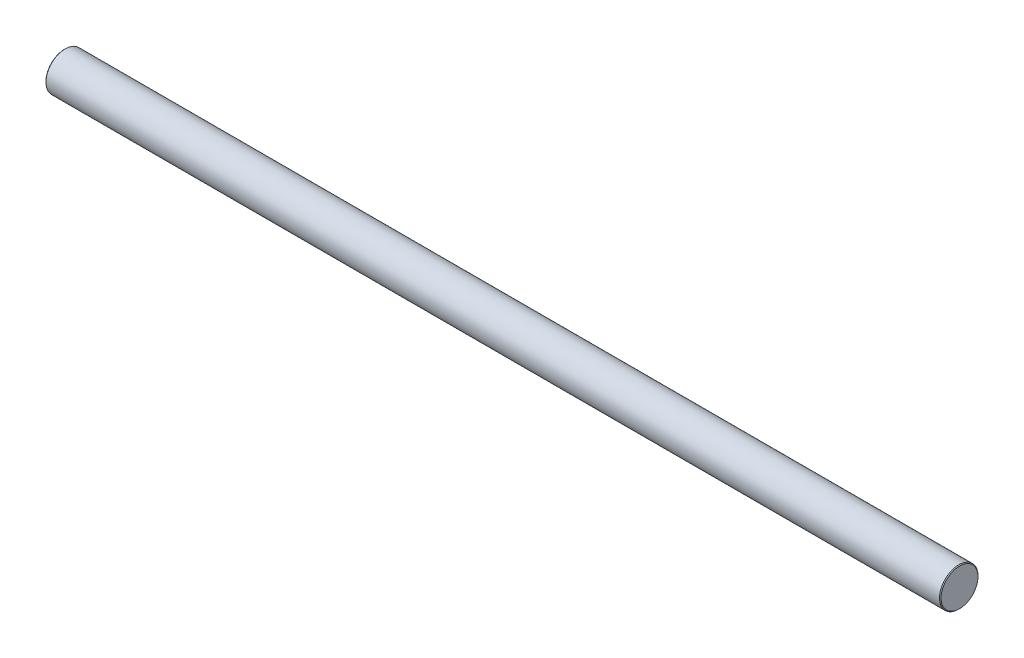
ISO-10303-21;
HEADER;
FILE_DESCRIPTION(('STEP AP214'),'2;1');
FILE_NAME('part.step','',(''),(''),'','','');
FILE_SCHEMA(('AUTOMOTIVE_DESIGN { 1 0 10303 214 1 1 1 1 }'));
ENDSEC;
DATA;
#1=APPLICATION_CONTEXT('core data for automotive mechanical design processes');
#2=APPLICATION_PROTOCOL_DEFINITION('international standard','automotive_design',2000,#1);
#3=PRODUCT_CONTEXT('',#1,'mechanical');
#4=PRODUCT('Part','Part','',(#3));
#5=PRODUCT_RELATED_PRODUCT_CATEGORY('part','',(#4));
#6=PRODUCT_DEFINITION_FORMATION('','',#4);
#7=PRODUCT_DEFINITION_CONTEXT('part definition',#1,'design');
#8=PRODUCT_DEFINITION('design','',#6,#7);
#9=PRODUCT_DEFINITION_SHAPE('','',#8);
#10=(LENGTH_UNIT() NAMED_UNIT(*) SI_UNIT(.MILLI.,.METRE.));
#11=(NAMED_UNIT(*) PLANE_ANGLE_UNIT() SI_UNIT($,.RADIAN.));
#12=(NAMED_UNIT(*) SI_UNIT($,.STERADIAN.) SOLID_ANGLE_UNIT());
#13=UNCERTAINTY_MEASURE_WITH_UNIT(LENGTH_MEASURE(1.E-05),#10,'distance_accuracy_value','');
#14=(GEOMETRIC_REPRESENTATION_CONTEXT(3) GLOBAL_UNCERTAINTY_ASSIGNED_CONTEXT((#13)) GLOBAL_UNIT_ASSIGNED_CONTEXT((#10,
#11,#12)) REPRESENTATION_CONTEXT('',''));
#15=CARTESIAN_POINT('',(0.,0.,0.));
#16=DIRECTION('',(0.,0.,1.));
#17=DIRECTION('',(1.,0.,0.));
#18=AXIS2_PLACEMENT_3D('',#15,#16,#17);
#19=CARTESIAN_POINT('',(25.4,0.,0.));
#20=DIRECTION('',(-1.,0.,0.));
#21=DIRECTION('',(0.,0.,1.));
#22=AXIS2_PLACEMENT_3D('',#19,#20,#21);
#23=CYLINDRICAL_SURFACE('',#22,1.0922);
#24=CARTESIAN_POINT('',(-25.356312,0.,0.));
#25=DIRECTION('',(1.,0.,0.));
#26=DIRECTION('',(0.,0.,-1.));
#27=AXIS2_PLACEMENT_3D('',#24,#25,#26);
#28=CIRCLE('',#27,1.0922);
#29=CARTESIAN_POINT('',(-25.356312,0.,-1.0922));
#30=VERTEX_POINT('',#29);
#31=EDGE_CURVE('E50',#30,#30,#28,.T.);
#32=ORIENTED_EDGE('',*,*,#31,.T.);
#33=EDGE_LOOP('',(#32));
#34=FACE_BOUND('',#33,.T.);
#35=CARTESIAN_POINT('',(25.356312,0.,0.));
#36=DIRECTION('',(1.,0.,0.));
#37=DIRECTION('',(0.,0.,-1.));
#38=AXIS2_PLACEMENT_3D('',#35,#36,#37);
#39=CIRCLE('',#38,1.0922);
#40=CARTESIAN_POINT('',(25.356312,0.,-1.0922));
#41=VERTEX_POINT('',#40);
#42=EDGE_CURVE('E54',#41,#41,#39,.F.);
#43=ORIENTED_EDGE('',*,*,#42,.T.);
#44=EDGE_LOOP('',(#43));
#45=FACE_BOUND('',#44,.T.);
#46=ADVANCED_FACE('F39',(#34,#45),#23,.T.);
#47=CARTESIAN_POINT('',(25.4,0.,0.));
#48=DIRECTION('',(1.,0.,0.));
#49=DIRECTION('',(0.,0.,-1.));
#50=AXIS2_PLACEMENT_3D('',#47,#48,#49);
#51=PLANE('',#50);
#52=CARTESIAN_POINT('',(25.4,0.,0.));
#53=DIRECTION('',(1.,0.,0.));
#54=DIRECTION('',(0.,0.,-1.));
#55=AXIS2_PLACEMENT_3D('',#52,#53,#54);
#56=CIRCLE('',#55,1.048512);
#57=CARTESIAN_POINT('',(25.4,0.,-1.048512));
#58=VERTEX_POINT('',#57);
#59=EDGE_CURVE('E10',#58,#58,#56,.T.);
#60=ORIENTED_EDGE('',*,*,#59,.T.);
#61=EDGE_LOOP('',(#60));
#62=FACE_BOUND('',#61,.T.);
#63=ADVANCED_FACE('F71',(#62),#51,.T.);
#64=CARTESIAN_POINT('',(-25.4,0.,0.));
#65=DIRECTION('',(1.,0.,0.));
#66=DIRECTION('',(0.,0.,-1.));
#67=AXIS2_PLACEMENT_3D('',#64,#65,#66);
#68=PLANE('',#67);
#69=CARTESIAN_POINT('',(-25.4,0.,0.));
#70=DIRECTION('',(1.,0.,0.));
#71=DIRECTION('',(0.,0.,-1.));
#72=AXIS2_PLACEMENT_3D('',#69,#70,#71);
#73=CIRCLE('',#72,1.04851199999999);
#74=CARTESIAN_POINT('',(-25.4,0.,-1.04851199999999));
#75=VERTEX_POINT('',#74);
#76=EDGE_CURVE('E46',#75,#75,#73,.F.);
#77=ORIENTED_EDGE('',*,*,#76,.T.);
#78=EDGE_LOOP('',(#77));
#79=FACE_BOUND('',#78,.T.);
#80=ADVANCED_FACE('F68',(#79),#68,.F.);
#81=CARTESIAN_POINT('',(-25.356312,0.,0.));
#82=DIRECTION('',(1.,0.,0.));
#83=DIRECTION('',(0.,0.,-1.));
#84=AXIS2_PLACEMENT_3D('',#81,#82,#83);
#85=CONICAL_SURFACE('',#84,1.0922,0.78539816339751);
#86=ORIENTED_EDGE('',*,*,#76,.F.);
#87=EDGE_LOOP('',(#86));
#88=FACE_BOUND('',#87,.T.);
#89=ORIENTED_EDGE('',*,*,#31,.F.);
#90=EDGE_LOOP('',(#89));
#91=FACE_BOUND('',#90,.T.);
#92=ADVANCED_FACE('F63',(#88,#91),#85,.T.);
#93=CARTESIAN_POINT('',(25.4,0.,0.));
#94=DIRECTION('',(-1.,0.,0.));
#95=DIRECTION('',(0.,0.,1.));
#96=AXIS2_PLACEMENT_3D('',#93,#94,#95);
#97=CONICAL_SURFACE('',#96,1.048512,0.785398163397431);
#98=ORIENTED_EDGE('',*,*,#42,.F.);
#99=EDGE_LOOP('',(#98));
#100=FACE_BOUND('',#99,.T.);
#101=ORIENTED_EDGE('',*,*,#59,.F.);
#102=EDGE_LOOP('',(#101));
#103=FACE_BOUND('',#102,.T.);
#104=ADVANCED_FACE('F41',(#100,#103),#97,.T.);
#105=CLOSED_SHELL('',(#46,#63,#80,#92,#104));
#106=MANIFOLD_SOLID_BREP('B2',#105);
#107=ADVANCED_BREP_SHAPE_REPRESENTATION('',(#18,#106),#14);
#108=SHAPE_DEFINITION_REPRESENTATION(#9,#107);
ENDSEC;
END-ISO-10303-21;
